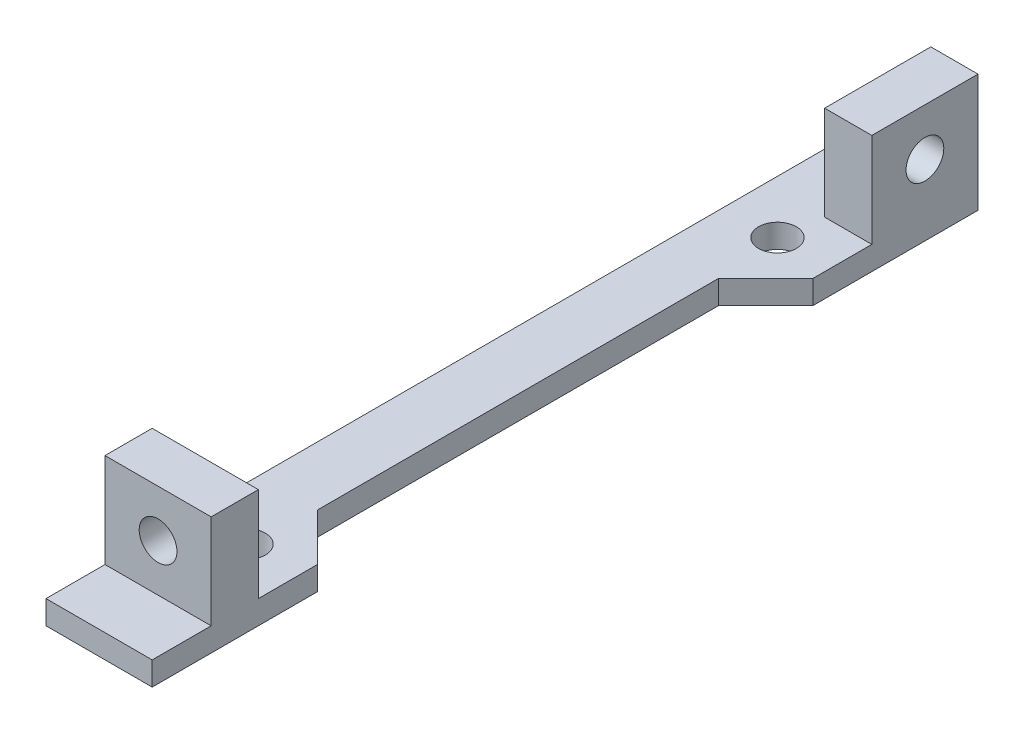
ISO-10303-21;
HEADER;
FILE_DESCRIPTION(('STEP AP214'),'2;1');
FILE_NAME('part.step','',(''),(''),'','','');
FILE_SCHEMA(('AUTOMOTIVE_DESIGN { 1 0 10303 214 1 1 1 1 }'));
ENDSEC;
DATA;
#1=APPLICATION_CONTEXT('core data for automotive mechanical design processes');
#2=APPLICATION_PROTOCOL_DEFINITION('international standard','automotive_design',2000,#1);
#3=PRODUCT_CONTEXT('',#1,'mechanical');
#4=PRODUCT('Part','Part','',(#3));
#5=PRODUCT_RELATED_PRODUCT_CATEGORY('part','',(#4));
#6=PRODUCT_DEFINITION_FORMATION('','',#4);
#7=PRODUCT_DEFINITION_CONTEXT('part definition',#1,'design');
#8=PRODUCT_DEFINITION('design','',#6,#7);
#9=PRODUCT_DEFINITION_SHAPE('','',#8);
#10=(LENGTH_UNIT() NAMED_UNIT(*) SI_UNIT(.MILLI.,.METRE.));
#11=(NAMED_UNIT(*) PLANE_ANGLE_UNIT() SI_UNIT($,.RADIAN.));
#12=(NAMED_UNIT(*) SI_UNIT($,.STERADIAN.) SOLID_ANGLE_UNIT());
#13=UNCERTAINTY_MEASURE_WITH_UNIT(LENGTH_MEASURE(1.E-05),#10,'distance_accuracy_value','');
#14=(GEOMETRIC_REPRESENTATION_CONTEXT(3) GLOBAL_UNCERTAINTY_ASSIGNED_CONTEXT((#13)) GLOBAL_UNIT_ASSIGNED_CONTEXT((#10,
#11,#12)) REPRESENTATION_CONTEXT('',''));
#15=CARTESIAN_POINT('',(0.,0.,0.));
#16=DIRECTION('',(0.,0.,1.));
#17=DIRECTION('',(1.,0.,0.));
#18=AXIS2_PLACEMENT_3D('',#15,#16,#17);
#19=CARTESIAN_POINT('',(4.5,2.,35.));
#20=DIRECTION('',(-1.,0.,0.));
#21=DIRECTION('',(0.,0.,1.));
#22=AXIS2_PLACEMENT_3D('',#19,#20,#21);
#23=PLANE('',#22);
#24=DIRECTION('',(0.,0.,-1.));
#25=VECTOR('',#24,1.);
#26=CARTESIAN_POINT('',(4.5,0.,35.));
#27=LINE('',#26,#25);
#28=CARTESIAN_POINT('',(4.5,0.,35.));
#29=VERTEX_POINT('',#28);
#30=CARTESIAN_POINT('',(4.5,0.,21.));
#31=VERTEX_POINT('',#30);
#32=EDGE_CURVE('E165',#29,#31,#27,.T.);
#33=ORIENTED_EDGE('',*,*,#32,.T.);
#34=DIRECTION('',(0.,1.,0.));
#35=VECTOR('',#34,1.);
#36=CARTESIAN_POINT('',(4.5,0.,21.));
#37=LINE('',#36,#35);
#38=CARTESIAN_POINT('',(4.5,2.,21.));
#39=VERTEX_POINT('',#38);
#40=EDGE_CURVE('E219',#31,#39,#37,.T.);
#41=ORIENTED_EDGE('',*,*,#40,.T.);
#42=DIRECTION('',(0.,0.,-1.));
#43=VECTOR('',#42,1.);
#44=CARTESIAN_POINT('',(4.5,2.,35.));
#45=LINE('',#44,#43);
#46=CARTESIAN_POINT('',(4.5,2.,26.));
#47=VERTEX_POINT('',#46);
#48=EDGE_CURVE('E275',#47,#39,#45,.T.);
#49=ORIENTED_EDGE('',*,*,#48,.F.);
#50=DIRECTION('',(0.,-1.,0.));
#51=VECTOR('',#50,1.);
#52=CARTESIAN_POINT('',(4.5,10.,26.));
#53=LINE('',#52,#51);
#54=CARTESIAN_POINT('',(4.5,10.,26.));
#55=VERTEX_POINT('',#54);
#56=EDGE_CURVE('E267',#55,#47,#53,.T.);
#57=ORIENTED_EDGE('',*,*,#56,.F.);
#58=DIRECTION('',(0.,0.,-1.));
#59=VECTOR('',#58,1.);
#60=CARTESIAN_POINT('',(4.5,10.,30.));
#61=LINE('',#60,#59);
#62=CARTESIAN_POINT('',(4.5,10.,30.));
#63=VERTEX_POINT('',#62);
#64=EDGE_CURVE('E256',#63,#55,#61,.T.);
#65=ORIENTED_EDGE('',*,*,#64,.F.);
#66=DIRECTION('',(0.,-1.,0.));
#67=VECTOR('',#66,1.);
#68=CARTESIAN_POINT('',(4.5,10.,30.));
#69=LINE('',#68,#67);
#70=CARTESIAN_POINT('',(4.5,2.,30.));
#71=VERTEX_POINT('',#70);
#72=EDGE_CURVE('E170',#63,#71,#69,.T.);
#73=ORIENTED_EDGE('',*,*,#72,.T.);
#74=CARTESIAN_POINT('',(4.5,2.,35.));
#75=VERTEX_POINT('',#74);
#76=EDGE_CURVE('E272',#75,#71,#45,.T.);
#77=ORIENTED_EDGE('',*,*,#76,.F.);
#78=DIRECTION('',(0.,-1.,0.));
#79=VECTOR('',#78,1.);
#80=CARTESIAN_POINT('',(4.5,2.,35.));
#81=LINE('',#80,#79);
#82=EDGE_CURVE('E181',#75,#29,#81,.T.);
#83=ORIENTED_EDGE('',*,*,#82,.T.);
#84=EDGE_LOOP('',(#33,#41,#49,#57,#65,#73,#77,#83));
#85=FACE_BOUND('',#84,.T.);
#86=ADVANCED_FACE('F33',(#85),#23,.F.);
#87=CARTESIAN_POINT('',(0.,2.,0.));
#88=DIRECTION('',(0.,-1.,0.));
#89=DIRECTION('',(0.,0.,-1.));
#90=AXIS2_PLACEMENT_3D('',#87,#88,#89);
#91=PLANE('',#90);
#92=CARTESIAN_POINT('',(0.,2.,-22.5));
#93=DIRECTION('',(0.,1.,0.));
#94=DIRECTION('',(0.,0.,1.));
#95=AXIS2_PLACEMENT_3D('',#92,#93,#94);
#96=CIRCLE('',#95,1.6);
#97=CARTESIAN_POINT('',(0.,2.,-20.9));
#98=VERTEX_POINT('',#97);
#99=EDGE_CURVE('E199',#98,#98,#96,.T.);
#100=ORIENTED_EDGE('',*,*,#99,.F.);
#101=EDGE_LOOP('',(#100));
#102=FACE_BOUND('',#101,.T.);
#103=CARTESIAN_POINT('',(0.,2.,22.5));
#104=DIRECTION('',(0.,1.,0.));
#105=DIRECTION('',(0.,0.,1.));
#106=AXIS2_PLACEMENT_3D('',#103,#104,#105);
#107=CIRCLE('',#106,1.6);
#108=CARTESIAN_POINT('',(0.,2.,24.1));
#109=VERTEX_POINT('',#108);
#110=EDGE_CURVE('E205',#109,#109,#107,.T.);
#111=ORIENTED_EDGE('',*,*,#110,.F.);
#112=EDGE_LOOP('',(#111));
#113=FACE_BOUND('',#112,.T.);
#114=ORIENTED_EDGE('',*,*,#48,.T.);
#115=DIRECTION('',(0.707106781186547,0.,0.707106781186548));
#116=VECTOR('',#115,1.);
#117=CARTESIAN_POINT('',(0.500000000000007,2.,17.));
#118=LINE('',#117,#116);
#119=CARTESIAN_POINT('',(0.500000000000007,2.,17.));
#120=VERTEX_POINT('',#119);
#121=EDGE_CURVE('E151',#120,#39,#118,.T.);
#122=ORIENTED_EDGE('',*,*,#121,.F.);
#123=DIRECTION('',(0.,0.,1.));
#124=VECTOR('',#123,1.);
#125=CARTESIAN_POINT('',(0.500000000000003,2.,-17.));
#126=LINE('',#125,#124);
#127=CARTESIAN_POINT('',(0.500000000000003,2.,-17.));
#128=VERTEX_POINT('',#127);
#129=EDGE_CURVE('E215',#128,#120,#126,.T.);
#130=ORIENTED_EDGE('',*,*,#129,.F.);
#131=DIRECTION('',(-0.707106781186547,0.,0.707106781186548));
#132=VECTOR('',#131,1.);
#133=CARTESIAN_POINT('',(4.5,2.,-21.));
#134=LINE('',#133,#132);
#135=CARTESIAN_POINT('',(4.5,2.,-21.));
#136=VERTEX_POINT('',#135);
#137=EDGE_CURVE('E203',#136,#128,#134,.T.);
#138=ORIENTED_EDGE('',*,*,#137,.F.);
#139=CARTESIAN_POINT('',(4.5,2.,-26.));
#140=VERTEX_POINT('',#139);
#141=EDGE_CURVE('E158',#136,#140,#45,.T.);
#142=ORIENTED_EDGE('',*,*,#141,.T.);
#143=DIRECTION('',(1.,0.,0.));
#144=VECTOR('',#143,1.);
#145=CARTESIAN_POINT('',(0.500000000000002,2.,-26.));
#146=LINE('',#145,#144);
#147=CARTESIAN_POINT('',(0.500000000000002,2.,-26.));
#148=VERTEX_POINT('',#147);
#149=EDGE_CURVE('E58',#148,#140,#146,.T.);
#150=ORIENTED_EDGE('',*,*,#149,.F.);
#151=DIRECTION('',(0.,0.,1.));
#152=VECTOR('',#151,1.);
#153=CARTESIAN_POINT('',(0.5,2.,-35.));
#154=LINE('',#153,#152);
#155=CARTESIAN_POINT('',(0.5,2.,-35.));
#156=VERTEX_POINT('',#155);
#157=EDGE_CURVE('E192',#156,#148,#154,.T.);
#158=ORIENTED_EDGE('',*,*,#157,.F.);
#159=DIRECTION('',(-1.,0.,0.));
#160=VECTOR('',#159,1.);
#161=CARTESIAN_POINT('',(-4.5,2.,-35.));
#162=LINE('',#161,#160);
#163=CARTESIAN_POINT('',(-4.5,2.,-35.));
#164=VERTEX_POINT('',#163);
#165=EDGE_CURVE('E274',#156,#164,#162,.T.);
#166=ORIENTED_EDGE('',*,*,#165,.T.);
#167=DIRECTION('',(0.,0.,1.));
#168=VECTOR('',#167,1.);
#169=CARTESIAN_POINT('',(-4.5,2.,35.));
#170=LINE('',#169,#168);
#171=CARTESIAN_POINT('',(-4.5,2.,26.));
#172=VERTEX_POINT('',#171);
#173=EDGE_CURVE('E277',#164,#172,#170,.T.);
#174=ORIENTED_EDGE('',*,*,#173,.T.);
#175=DIRECTION('',(-1.,0.,0.));
#176=VECTOR('',#175,1.);
#177=CARTESIAN_POINT('',(-4.5,2.,26.));
#178=LINE('',#177,#176);
#179=EDGE_CURVE('E254',#47,#172,#178,.T.);
#180=ORIENTED_EDGE('',*,*,#179,.F.);
#181=EDGE_LOOP('',(#114,#122,#130,#138,#142,#150,#158,#166,#174,#180));
#182=FACE_BOUND('',#181,.T.);
#183=ADVANCED_FACE('F308',(#102,#113,#182),#91,.F.);
#184=DIRECTION('',(1.,0.,0.));
#185=VECTOR('',#184,1.);
#186=CARTESIAN_POINT('',(-4.5,2.,30.));
#187=LINE('',#186,#185);
#188=CARTESIAN_POINT('',(-4.5,2.,30.));
#189=VERTEX_POINT('',#188);
#190=EDGE_CURVE('E249',#189,#71,#187,.T.);
#191=ORIENTED_EDGE('',*,*,#190,.F.);
#192=CARTESIAN_POINT('',(-4.5,2.,35.));
#193=VERTEX_POINT('',#192);
#194=EDGE_CURVE('E276',#189,#193,#170,.T.);
#195=ORIENTED_EDGE('',*,*,#194,.T.);
#196=DIRECTION('',(1.,0.,0.));
#197=VECTOR('',#196,1.);
#198=CARTESIAN_POINT('',(-4.5,2.,35.));
#199=LINE('',#198,#197);
#200=EDGE_CURVE('E174',#193,#75,#199,.T.);
#201=ORIENTED_EDGE('',*,*,#200,.T.);
#202=ORIENTED_EDGE('',*,*,#76,.T.);
#203=EDGE_LOOP('',(#191,#195,#201,#202));
#204=FACE_BOUND('',#203,.T.);
#205=ADVANCED_FACE('F282',(#204),#91,.F.);
#206=CARTESIAN_POINT('',(4.5,6.,-30.5));
#207=DIRECTION('',(1.,0.,0.));
#208=DIRECTION('',(0.,0.,-1.));
#209=AXIS2_PLACEMENT_3D('',#206,#207,#208);
#210=CIRCLE('',#209,1.6);
#211=CARTESIAN_POINT('',(4.5,6.,-32.1));
#212=VERTEX_POINT('',#211);
#213=EDGE_CURVE('E196',#212,#212,#210,.T.);
#214=ORIENTED_EDGE('',*,*,#213,.F.);
#215=EDGE_LOOP('',(#214));
#216=FACE_BOUND('',#215,.T.);
#217=ORIENTED_EDGE('',*,*,#141,.F.);
#218=DIRECTION('',(0.,1.,0.));
#219=VECTOR('',#218,1.);
#220=CARTESIAN_POINT('',(4.5,0.,-21.));
#221=LINE('',#220,#219);
#222=CARTESIAN_POINT('',(4.5,0.,-21.));
#223=VERTEX_POINT('',#222);
#224=EDGE_CURVE('E146',#223,#136,#221,.T.);
#225=ORIENTED_EDGE('',*,*,#224,.F.);
#226=CARTESIAN_POINT('',(4.5,0.,-35.));
#227=VERTEX_POINT('',#226);
#228=EDGE_CURVE('E155',#223,#227,#27,.T.);
#229=ORIENTED_EDGE('',*,*,#228,.T.);
#230=DIRECTION('',(0.,-1.,0.));
#231=VECTOR('',#230,1.);
#232=CARTESIAN_POINT('',(4.5,2.,-35.));
#233=LINE('',#232,#231);
#234=CARTESIAN_POINT('',(4.5,10.,-35.));
#235=VERTEX_POINT('',#234);
#236=EDGE_CURVE('E11',#235,#227,#233,.T.);
#237=ORIENTED_EDGE('',*,*,#236,.F.);
#238=DIRECTION('',(0.,0.,-1.));
#239=VECTOR('',#238,1.);
#240=CARTESIAN_POINT('',(4.5,10.,-35.));
#241=LINE('',#240,#239);
#242=CARTESIAN_POINT('',(4.5,10.,-26.));
#243=VERTEX_POINT('',#242);
#244=EDGE_CURVE('E234',#243,#235,#241,.T.);
#245=ORIENTED_EDGE('',*,*,#244,.F.);
#246=DIRECTION('',(0.,-1.,0.));
#247=VECTOR('',#246,1.);
#248=CARTESIAN_POINT('',(4.5,10.,-26.));
#249=LINE('',#248,#247);
#250=EDGE_CURVE('E245',#243,#140,#249,.T.);
#251=ORIENTED_EDGE('',*,*,#250,.T.);
#252=EDGE_LOOP('',(#217,#225,#229,#237,#245,#251));
#253=FACE_BOUND('',#252,.T.);
#254=ADVANCED_FACE('F35',(#216,#253),#23,.F.);
#255=CARTESIAN_POINT('',(-4.5,2.,-35.));
#256=DIRECTION('',(0.,0.,1.));
#257=DIRECTION('',(1.,0.,0.));
#258=AXIS2_PLACEMENT_3D('',#255,#256,#257);
#259=PLANE('',#258);
#260=DIRECTION('',(-1.,0.,0.));
#261=VECTOR('',#260,1.);
#262=CARTESIAN_POINT('',(-4.5,0.,-35.));
#263=LINE('',#262,#261);
#264=CARTESIAN_POINT('',(-4.5,0.,-35.));
#265=VERTEX_POINT('',#264);
#266=EDGE_CURVE('E164',#227,#265,#263,.T.);
#267=ORIENTED_EDGE('',*,*,#266,.T.);
#268=DIRECTION('',(0.,-1.,0.));
#269=VECTOR('',#268,1.);
#270=CARTESIAN_POINT('',(-4.5,2.,-35.));
#271=LINE('',#270,#269);
#272=EDGE_CURVE('E42',#164,#265,#271,.T.);
#273=ORIENTED_EDGE('',*,*,#272,.F.);
#274=ORIENTED_EDGE('',*,*,#165,.F.);
#275=DIRECTION('',(0.,-1.,0.));
#276=VECTOR('',#275,1.);
#277=CARTESIAN_POINT('',(0.5,10.,-35.));
#278=LINE('',#277,#276);
#279=CARTESIAN_POINT('',(0.5,10.,-35.));
#280=VERTEX_POINT('',#279);
#281=EDGE_CURVE('E239',#280,#156,#278,.T.);
#282=ORIENTED_EDGE('',*,*,#281,.F.);
#283=DIRECTION('',(-1.,0.,0.));
#284=VECTOR('',#283,1.);
#285=CARTESIAN_POINT('',(0.5,10.,-35.));
#286=LINE('',#285,#284);
#287=EDGE_CURVE('E237',#235,#280,#286,.T.);
#288=ORIENTED_EDGE('',*,*,#287,.F.);
#289=ORIENTED_EDGE('',*,*,#236,.T.);
#290=EDGE_LOOP('',(#267,#273,#274,#282,#288,#289));
#291=FACE_BOUND('',#290,.T.);
#292=ADVANCED_FACE('F321',(#291),#259,.F.);
#293=CARTESIAN_POINT('',(-4.5,2.,35.));
#294=DIRECTION('',(1.,0.,0.));
#295=DIRECTION('',(0.,0.,-1.));
#296=AXIS2_PLACEMENT_3D('',#293,#294,#295);
#297=PLANE('',#296);
#298=DIRECTION('',(0.,0.,1.));
#299=VECTOR('',#298,1.);
#300=CARTESIAN_POINT('',(-4.5,0.,35.));
#301=LINE('',#300,#299);
#302=CARTESIAN_POINT('',(-4.5,0.,35.));
#303=VERTEX_POINT('',#302);
#304=EDGE_CURVE('E177',#265,#303,#301,.T.);
#305=ORIENTED_EDGE('',*,*,#304,.T.);
#306=DIRECTION('',(0.,-1.,0.));
#307=VECTOR('',#306,1.);
#308=CARTESIAN_POINT('',(-4.5,2.,35.));
#309=LINE('',#308,#307);
#310=EDGE_CURVE('E184',#193,#303,#309,.T.);
#311=ORIENTED_EDGE('',*,*,#310,.F.);
#312=ORIENTED_EDGE('',*,*,#194,.F.);
#313=DIRECTION('',(0.,-1.,0.));
#314=VECTOR('',#313,1.);
#315=CARTESIAN_POINT('',(-4.5,10.,30.));
#316=LINE('',#315,#314);
#317=CARTESIAN_POINT('',(-4.5,10.,30.));
#318=VERTEX_POINT('',#317);
#319=EDGE_CURVE('E166',#318,#189,#316,.T.);
#320=ORIENTED_EDGE('',*,*,#319,.F.);
#321=DIRECTION('',(0.,0.,1.));
#322=VECTOR('',#321,1.);
#323=CARTESIAN_POINT('',(-4.5,10.,30.));
#324=LINE('',#323,#322);
#325=CARTESIAN_POINT('',(-4.5,10.,26.));
#326=VERTEX_POINT('',#325);
#327=EDGE_CURVE('E250',#326,#318,#324,.T.);
#328=ORIENTED_EDGE('',*,*,#327,.F.);
#329=DIRECTION('',(0.,-1.,0.));
#330=VECTOR('',#329,1.);
#331=CARTESIAN_POINT('',(-4.5,10.,26.));
#332=LINE('',#331,#330);
#333=EDGE_CURVE('E260',#326,#172,#332,.T.);
#334=ORIENTED_EDGE('',*,*,#333,.T.);
#335=ORIENTED_EDGE('',*,*,#173,.F.);
#336=ORIENTED_EDGE('',*,*,#272,.T.);
#337=EDGE_LOOP('',(#305,#311,#312,#320,#328,#334,#335,#336));
#338=FACE_BOUND('',#337,.T.);
#339=ADVANCED_FACE('F287',(#338),#297,.F.);
#340=CARTESIAN_POINT('',(-4.5,2.,35.));
#341=DIRECTION('',(0.,0.,-1.));
#342=DIRECTION('',(-1.,0.,0.));
#343=AXIS2_PLACEMENT_3D('',#340,#341,#342);
#344=PLANE('',#343);
#345=DIRECTION('',(1.,0.,0.));
#346=VECTOR('',#345,1.);
#347=CARTESIAN_POINT('',(-4.5,0.,35.));
#348=LINE('',#347,#346);
#349=EDGE_CURVE('E179',#303,#29,#348,.T.);
#350=ORIENTED_EDGE('',*,*,#349,.T.);
#351=ORIENTED_EDGE('',*,*,#82,.F.);
#352=ORIENTED_EDGE('',*,*,#200,.F.);
#353=ORIENTED_EDGE('',*,*,#310,.T.);
#354=EDGE_LOOP('',(#350,#351,#352,#353));
#355=FACE_BOUND('',#354,.T.);
#356=ADVANCED_FACE('F290',(#355),#344,.F.);
#357=CARTESIAN_POINT('',(0.,0.,0.));
#358=DIRECTION('',(0.,-1.,0.));
#359=DIRECTION('',(0.,0.,-1.));
#360=AXIS2_PLACEMENT_3D('',#357,#358,#359);
#361=PLANE('',#360);
#362=CARTESIAN_POINT('',(0.,0.,-22.5));
#363=DIRECTION('',(0.,-1.,0.));
#364=DIRECTION('',(0.,0.,-1.));
#365=AXIS2_PLACEMENT_3D('',#362,#363,#364);
#366=CIRCLE('',#365,1.6);
#367=CARTESIAN_POINT('',(0.,0.,-24.1));
#368=VERTEX_POINT('',#367);
#369=EDGE_CURVE('E37',#368,#368,#366,.T.);
#370=ORIENTED_EDGE('',*,*,#369,.F.);
#371=EDGE_LOOP('',(#370));
#372=FACE_BOUND('',#371,.T.);
#373=CARTESIAN_POINT('',(0.,0.,22.5));
#374=DIRECTION('',(0.,-1.,0.));
#375=DIRECTION('',(0.,0.,-1.));
#376=AXIS2_PLACEMENT_3D('',#373,#374,#375);
#377=CIRCLE('',#376,1.6);
#378=CARTESIAN_POINT('',(0.,0.,20.9));
#379=VERTEX_POINT('',#378);
#380=EDGE_CURVE('E197',#379,#379,#377,.T.);
#381=ORIENTED_EDGE('',*,*,#380,.F.);
#382=EDGE_LOOP('',(#381));
#383=FACE_BOUND('',#382,.T.);
#384=DIRECTION('',(0.707106781186547,0.,0.707106781186548));
#385=VECTOR('',#384,1.);
#386=CARTESIAN_POINT('',(0.500000000000007,0.,17.));
#387=LINE('',#386,#385);
#388=CARTESIAN_POINT('',(0.500000000000007,0.,17.));
#389=VERTEX_POINT('',#388);
#390=EDGE_CURVE('E159',#389,#31,#387,.T.);
#391=ORIENTED_EDGE('',*,*,#390,.T.);
#392=ORIENTED_EDGE('',*,*,#32,.F.);
#393=ORIENTED_EDGE('',*,*,#349,.F.);
#394=ORIENTED_EDGE('',*,*,#304,.F.);
#395=ORIENTED_EDGE('',*,*,#266,.F.);
#396=ORIENTED_EDGE('',*,*,#228,.F.);
#397=DIRECTION('',(-0.707106781186547,0.,0.707106781186548));
#398=VECTOR('',#397,1.);
#399=CARTESIAN_POINT('',(4.5,0.,-21.));
#400=LINE('',#399,#398);
#401=CARTESIAN_POINT('',(0.500000000000002,0.,-17.));
#402=VERTEX_POINT('',#401);
#403=EDGE_CURVE('E142',#223,#402,#400,.T.);
#404=ORIENTED_EDGE('',*,*,#403,.T.);
#405=DIRECTION('',(0.,0.,1.));
#406=VECTOR('',#405,1.);
#407=CARTESIAN_POINT('',(0.500000000000003,0.,-17.));
#408=LINE('',#407,#406);
#409=EDGE_CURVE('E50',#402,#389,#408,.T.);
#410=ORIENTED_EDGE('',*,*,#409,.T.);
#411=EDGE_LOOP('',(#391,#392,#393,#394,#395,#396,#404,#410));
#412=FACE_BOUND('',#411,.T.);
#413=ADVANCED_FACE('F162',(#372,#383,#412),#361,.T.);
#414=CARTESIAN_POINT('',(-4.5,10.,30.));
#415=DIRECTION('',(0.,0.,-1.));
#416=DIRECTION('',(-1.,0.,0.));
#417=AXIS2_PLACEMENT_3D('',#414,#415,#416);
#418=PLANE('',#417);
#419=CARTESIAN_POINT('',(0.,6.,30.));
#420=DIRECTION('',(0.,0.,1.));
#421=DIRECTION('',(1.,0.,0.));
#422=AXIS2_PLACEMENT_3D('',#419,#420,#421);
#423=CIRCLE('',#422,1.6);
#424=CARTESIAN_POINT('',(1.6,6.,30.));
#425=VERTEX_POINT('',#424);
#426=EDGE_CURVE('E193',#425,#425,#423,.T.);
#427=ORIENTED_EDGE('',*,*,#426,.F.);
#428=EDGE_LOOP('',(#427));
#429=FACE_BOUND('',#428,.T.);
#430=ORIENTED_EDGE('',*,*,#190,.T.);
#431=ORIENTED_EDGE('',*,*,#72,.F.);
#432=DIRECTION('',(1.,0.,0.));
#433=VECTOR('',#432,1.);
#434=CARTESIAN_POINT('',(-4.5,10.,30.));
#435=LINE('',#434,#433);
#436=EDGE_CURVE('E253',#318,#63,#435,.T.);
#437=ORIENTED_EDGE('',*,*,#436,.F.);
#438=ORIENTED_EDGE('',*,*,#319,.T.);
#439=EDGE_LOOP('',(#430,#431,#437,#438));
#440=FACE_BOUND('',#439,.T.);
#441=ADVANCED_FACE('F297',(#429,#440),#418,.F.);
#442=CARTESIAN_POINT('',(-4.5,10.,26.));
#443=DIRECTION('',(0.,0.,1.));
#444=DIRECTION('',(1.,0.,0.));
#445=AXIS2_PLACEMENT_3D('',#442,#443,#444);
#446=PLANE('',#445);
#447=CARTESIAN_POINT('',(0.,6.,26.));
#448=DIRECTION('',(0.,0.,1.));
#449=DIRECTION('',(1.,0.,0.));
#450=AXIS2_PLACEMENT_3D('',#447,#448,#449);
#451=CIRCLE('',#450,1.6);
#452=CARTESIAN_POINT('',(1.6,6.,26.));
#453=VERTEX_POINT('',#452);
#454=EDGE_CURVE('E189',#453,#453,#451,.T.);
#455=ORIENTED_EDGE('',*,*,#454,.T.);
#456=EDGE_LOOP('',(#455));
#457=FACE_BOUND('',#456,.T.);
#458=ORIENTED_EDGE('',*,*,#179,.T.);
#459=ORIENTED_EDGE('',*,*,#333,.F.);
#460=DIRECTION('',(-1.,0.,0.));
#461=VECTOR('',#460,1.);
#462=CARTESIAN_POINT('',(-4.5,10.,26.));
#463=LINE('',#462,#461);
#464=EDGE_CURVE('E258',#55,#326,#463,.T.);
#465=ORIENTED_EDGE('',*,*,#464,.F.);
#466=ORIENTED_EDGE('',*,*,#56,.T.);
#467=EDGE_LOOP('',(#458,#459,#465,#466));
#468=FACE_BOUND('',#467,.T.);
#469=ADVANCED_FACE('F305',(#457,#468),#446,.F.);
#470=CARTESIAN_POINT('',(0.,10.,0.));
#471=DIRECTION('',(0.,-1.,0.));
#472=DIRECTION('',(0.,0.,-1.));
#473=AXIS2_PLACEMENT_3D('',#470,#471,#472);
#474=PLANE('',#473);
#475=ORIENTED_EDGE('',*,*,#327,.T.);
#476=ORIENTED_EDGE('',*,*,#436,.T.);
#477=ORIENTED_EDGE('',*,*,#64,.T.);
#478=ORIENTED_EDGE('',*,*,#464,.T.);
#479=EDGE_LOOP('',(#475,#476,#477,#478));
#480=FACE_BOUND('',#479,.T.);
#481=ADVANCED_FACE('F301',(#480),#474,.F.);
#482=CARTESIAN_POINT('',(0.5,10.,-35.));
#483=DIRECTION('',(1.,0.,0.));
#484=DIRECTION('',(0.,0.,-1.));
#485=AXIS2_PLACEMENT_3D('',#482,#483,#484);
#486=PLANE('',#485);
#487=CARTESIAN_POINT('',(0.500000000000001,6.,-30.5));
#488=DIRECTION('',(1.,0.,0.));
#489=DIRECTION('',(0.,0.,-1.));
#490=AXIS2_PLACEMENT_3D('',#487,#488,#489);
#491=CIRCLE('',#490,1.6);
#492=CARTESIAN_POINT('',(0.500000000000001,6.,-32.1));
#493=VERTEX_POINT('',#492);
#494=EDGE_CURVE('E194',#493,#493,#491,.T.);
#495=ORIENTED_EDGE('',*,*,#494,.T.);
#496=EDGE_LOOP('',(#495));
#497=FACE_BOUND('',#496,.T.);
#498=ORIENTED_EDGE('',*,*,#157,.T.);
#499=DIRECTION('',(0.,-1.,0.));
#500=VECTOR('',#499,1.);
#501=CARTESIAN_POINT('',(0.500000000000002,10.,-26.));
#502=LINE('',#501,#500);
#503=CARTESIAN_POINT('',(0.500000000000002,10.,-26.));
#504=VERTEX_POINT('',#503);
#505=EDGE_CURVE('E247',#504,#148,#502,.T.);
#506=ORIENTED_EDGE('',*,*,#505,.F.);
#507=DIRECTION('',(0.,0.,1.));
#508=VECTOR('',#507,1.);
#509=CARTESIAN_POINT('',(0.5,10.,-35.));
#510=LINE('',#509,#508);
#511=EDGE_CURVE('E229',#280,#504,#510,.T.);
#512=ORIENTED_EDGE('',*,*,#511,.F.);
#513=ORIENTED_EDGE('',*,*,#281,.T.);
#514=EDGE_LOOP('',(#498,#506,#512,#513));
#515=FACE_BOUND('',#514,.T.);
#516=ADVANCED_FACE('F325',(#497,#515),#486,.F.);
#517=CARTESIAN_POINT('',(0.500000000000002,10.,-26.));
#518=DIRECTION('',(0.,0.,-1.));
#519=DIRECTION('',(-1.,0.,0.));
#520=AXIS2_PLACEMENT_3D('',#517,#518,#519);
#521=PLANE('',#520);
#522=ORIENTED_EDGE('',*,*,#149,.T.);
#523=ORIENTED_EDGE('',*,*,#250,.F.);
#524=DIRECTION('',(1.,0.,0.));
#525=VECTOR('',#524,1.);
#526=CARTESIAN_POINT('',(0.500000000000002,10.,-26.));
#527=LINE('',#526,#525);
#528=EDGE_CURVE('E232',#504,#243,#527,.T.);
#529=ORIENTED_EDGE('',*,*,#528,.F.);
#530=ORIENTED_EDGE('',*,*,#505,.T.);
#531=EDGE_LOOP('',(#522,#523,#529,#530));
#532=FACE_BOUND('',#531,.T.);
#533=ADVANCED_FACE('F313',(#532),#521,.F.);
#534=CARTESIAN_POINT('',(0.,10.,0.));
#535=DIRECTION('',(0.,1.,0.));
#536=DIRECTION('',(0.,0.,1.));
#537=AXIS2_PLACEMENT_3D('',#534,#535,#536);
#538=PLANE('',#537);
#539=ORIENTED_EDGE('',*,*,#511,.T.);
#540=ORIENTED_EDGE('',*,*,#528,.T.);
#541=ORIENTED_EDGE('',*,*,#244,.T.);
#542=ORIENTED_EDGE('',*,*,#287,.T.);
#543=EDGE_LOOP('',(#539,#540,#541,#542));
#544=FACE_BOUND('',#543,.T.);
#545=ADVANCED_FACE('F318',(#544),#538,.T.);
#546=CARTESIAN_POINT('',(0.,6.,25.));
#547=DIRECTION('',(0.,0.,1.));
#548=DIRECTION('',(1.,0.,0.));
#549=AXIS2_PLACEMENT_3D('',#546,#547,#548);
#550=CYLINDRICAL_SURFACE('',#549,1.6);
#551=ORIENTED_EDGE('',*,*,#426,.T.);
#552=EDGE_LOOP('',(#551));
#553=FACE_BOUND('',#552,.T.);
#554=ORIENTED_EDGE('',*,*,#454,.F.);
#555=EDGE_LOOP('',(#554));
#556=FACE_BOUND('',#555,.T.);
#557=ADVANCED_FACE('F356',(#553,#556),#550,.F.);
#558=CARTESIAN_POINT('',(-0.5,6.,-30.5));
#559=DIRECTION('',(1.,0.,0.));
#560=DIRECTION('',(0.,0.,-1.));
#561=AXIS2_PLACEMENT_3D('',#558,#559,#560);
#562=CYLINDRICAL_SURFACE('',#561,1.6);
#563=ORIENTED_EDGE('',*,*,#213,.T.);
#564=EDGE_LOOP('',(#563));
#565=FACE_BOUND('',#564,.T.);
#566=ORIENTED_EDGE('',*,*,#494,.F.);
#567=EDGE_LOOP('',(#566));
#568=FACE_BOUND('',#567,.T.);
#569=ADVANCED_FACE('F338',(#565,#568),#562,.F.);
#570=CARTESIAN_POINT('',(0.500000000000007,0.,17.));
#571=DIRECTION('',(-0.707106781186548,0.,0.707106781186547));
#572=DIRECTION('',(0.707106781186547,0.,0.707106781186548));
#573=AXIS2_PLACEMENT_3D('',#570,#571,#572);
#574=PLANE('',#573);
#575=ORIENTED_EDGE('',*,*,#121,.T.);
#576=ORIENTED_EDGE('',*,*,#40,.F.);
#577=ORIENTED_EDGE('',*,*,#390,.F.);
#578=DIRECTION('',(0.,1.,0.));
#579=VECTOR('',#578,1.);
#580=CARTESIAN_POINT('',(0.500000000000007,0.,17.));
#581=LINE('',#580,#579);
#582=EDGE_CURVE('E222',#389,#120,#581,.T.);
#583=ORIENTED_EDGE('',*,*,#582,.T.);
#584=EDGE_LOOP('',(#575,#576,#577,#583));
#585=FACE_BOUND('',#584,.T.);
#586=ADVANCED_FACE('F328',(#585),#574,.F.);
#587=CARTESIAN_POINT('',(0.500000000000003,0.,-17.));
#588=DIRECTION('',(-1.,0.,0.));
#589=DIRECTION('',(0.,0.,1.));
#590=AXIS2_PLACEMENT_3D('',#587,#588,#589);
#591=PLANE('',#590);
#592=ORIENTED_EDGE('',*,*,#129,.T.);
#593=ORIENTED_EDGE('',*,*,#582,.F.);
#594=ORIENTED_EDGE('',*,*,#409,.F.);
#595=DIRECTION('',(0.,1.,0.));
#596=VECTOR('',#595,1.);
#597=CARTESIAN_POINT('',(0.500000000000003,0.,-17.));
#598=LINE('',#597,#596);
#599=EDGE_CURVE('E148',#402,#128,#598,.T.);
#600=ORIENTED_EDGE('',*,*,#599,.T.);
#601=EDGE_LOOP('',(#592,#593,#594,#600));
#602=FACE_BOUND('',#601,.T.);
#603=ADVANCED_FACE('F329',(#602),#591,.F.);
#604=CARTESIAN_POINT('',(4.5,0.,-21.));
#605=DIRECTION('',(-0.707106781186548,0.,-0.707106781186547));
#606=DIRECTION('',(-0.707106781186547,0.,0.707106781186548));
#607=AXIS2_PLACEMENT_3D('',#604,#605,#606);
#608=PLANE('',#607);
#609=ORIENTED_EDGE('',*,*,#137,.T.);
#610=ORIENTED_EDGE('',*,*,#599,.F.);
#611=ORIENTED_EDGE('',*,*,#403,.F.);
#612=ORIENTED_EDGE('',*,*,#224,.T.);
#613=EDGE_LOOP('',(#609,#610,#611,#612));
#614=FACE_BOUND('',#613,.T.);
#615=ADVANCED_FACE('F145',(#614),#608,.F.);
#616=CARTESIAN_POINT('',(0.,-3.,22.5));
#617=DIRECTION('',(0.,1.,0.));
#618=DIRECTION('',(0.,0.,1.));
#619=AXIS2_PLACEMENT_3D('',#616,#617,#618);
#620=CYLINDRICAL_SURFACE('',#619,1.6);
#621=ORIENTED_EDGE('',*,*,#380,.T.);
#622=EDGE_LOOP('',(#621));
#623=FACE_BOUND('',#622,.T.);
#624=ORIENTED_EDGE('',*,*,#110,.T.);
#625=EDGE_LOOP('',(#624));
#626=FACE_BOUND('',#625,.T.);
#627=ADVANCED_FACE('F336',(#623,#626),#620,.F.);
#628=CARTESIAN_POINT('',(0.,-3.,-22.5));
#629=DIRECTION('',(0.,1.,0.));
#630=DIRECTION('',(0.,0.,1.));
#631=AXIS2_PLACEMENT_3D('',#628,#629,#630);
#632=CYLINDRICAL_SURFACE('',#631,1.6);
#633=ORIENTED_EDGE('',*,*,#369,.T.);
#634=EDGE_LOOP('',(#633));
#635=FACE_BOUND('',#634,.T.);
#636=ORIENTED_EDGE('',*,*,#99,.T.);
#637=EDGE_LOOP('',(#636));
#638=FACE_BOUND('',#637,.T.);
#639=ADVANCED_FACE('F499',(#635,#638),#632,.F.);
#640=CLOSED_SHELL('',(#86,#183,#205,#254,#292,#339,#356,#413,#441,#469,#481,#516,#533,#545,#557,
#569,#586,#603,#615,#627,#639));
#641=MANIFOLD_SOLID_BREP('B2',#640);
#642=ADVANCED_BREP_SHAPE_REPRESENTATION('',(#18,#641),#14);
#643=SHAPE_DEFINITION_REPRESENTATION(#9,#642);
ENDSEC;
END-ISO-10303-21;
